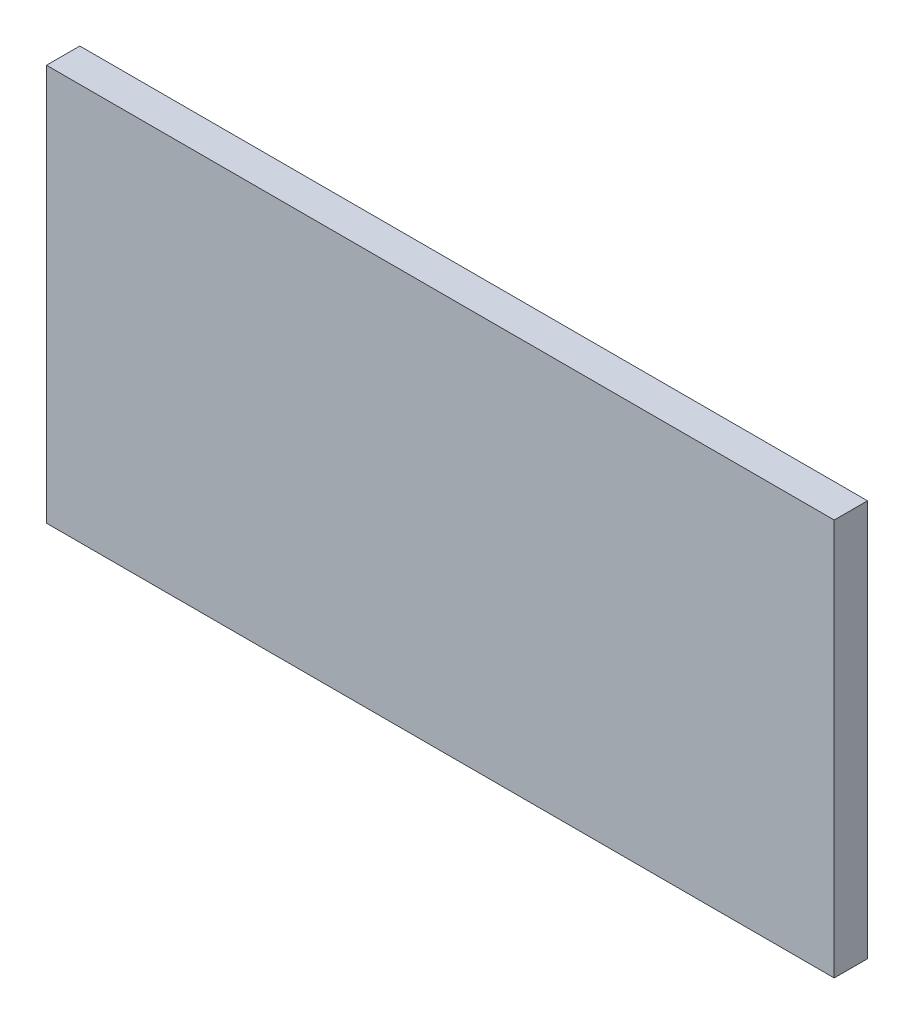
ISO-10303-21;
HEADER;
FILE_DESCRIPTION(('STEP AP214'),'2;1');
FILE_NAME('part.step','',(''),(''),'','','');
FILE_SCHEMA(('AUTOMOTIVE_DESIGN { 1 0 10303 214 1 1 1 1 }'));
ENDSEC;
DATA;
#1=APPLICATION_CONTEXT('core data for automotive mechanical design processes');
#2=APPLICATION_PROTOCOL_DEFINITION('international standard','automotive_design',2000,#1);
#3=PRODUCT_CONTEXT('',#1,'mechanical');
#4=PRODUCT('Part','Part','',(#3));
#5=PRODUCT_RELATED_PRODUCT_CATEGORY('part','',(#4));
#6=PRODUCT_DEFINITION_FORMATION('','',#4);
#7=PRODUCT_DEFINITION_CONTEXT('part definition',#1,'design');
#8=PRODUCT_DEFINITION('design','',#6,#7);
#9=PRODUCT_DEFINITION_SHAPE('','',#8);
#10=(LENGTH_UNIT() NAMED_UNIT(*) SI_UNIT(.MILLI.,.METRE.));
#11=(NAMED_UNIT(*) PLANE_ANGLE_UNIT() SI_UNIT($,.RADIAN.));
#12=(NAMED_UNIT(*) SI_UNIT($,.STERADIAN.) SOLID_ANGLE_UNIT());
#13=UNCERTAINTY_MEASURE_WITH_UNIT(LENGTH_MEASURE(1.E-05),#10,'distance_accuracy_value','');
#14=(GEOMETRIC_REPRESENTATION_CONTEXT(3) GLOBAL_UNCERTAINTY_ASSIGNED_CONTEXT((#13)) GLOBAL_UNIT_ASSIGNED_CONTEXT((#10,
#11,#12)) REPRESENTATION_CONTEXT('',''));
#15=CARTESIAN_POINT('',(0.,0.,0.));
#16=DIRECTION('',(0.,0.,1.));
#17=DIRECTION('',(1.,0.,0.));
#18=AXIS2_PLACEMENT_3D('',#15,#16,#17);
#19=CARTESIAN_POINT('',(0.,0.,6.));
#20=DIRECTION('',(-1.,0.,0.));
#21=DIRECTION('',(0.,0.,1.));
#22=AXIS2_PLACEMENT_3D('',#19,#20,#21);
#23=PLANE('',#22);
#24=DIRECTION('',(0.,1.,0.));
#25=VECTOR('',#24,1.);
#26=CARTESIAN_POINT('',(0.,0.,0.));
#27=LINE('',#26,#25);
#28=CARTESIAN_POINT('',(0.,0.,0.));
#29=VERTEX_POINT('',#28);
#30=CARTESIAN_POINT('',(0.,71.5,0.));
#31=VERTEX_POINT('',#30);
#32=EDGE_CURVE('E96',#29,#31,#27,.T.);
#33=ORIENTED_EDGE('',*,*,#32,.T.);
#34=DIRECTION('',(0.,0.,-1.));
#35=VECTOR('',#34,1.);
#36=CARTESIAN_POINT('',(0.,71.5,6.));
#37=LINE('',#36,#35);
#38=CARTESIAN_POINT('',(0.,71.5,6.));
#39=VERTEX_POINT('',#38);
#40=EDGE_CURVE('E11',#39,#31,#37,.T.);
#41=ORIENTED_EDGE('',*,*,#40,.F.);
#42=DIRECTION('',(0.,1.,0.));
#43=VECTOR('',#42,1.);
#44=CARTESIAN_POINT('',(0.,0.,6.));
#45=LINE('',#44,#43);
#46=CARTESIAN_POINT('',(0.,0.,6.));
#47=VERTEX_POINT('',#46);
#48=EDGE_CURVE('E84',#47,#39,#45,.T.);
#49=ORIENTED_EDGE('',*,*,#48,.F.);
#50=DIRECTION('',(0.,0.,-1.));
#51=VECTOR('',#50,1.);
#52=CARTESIAN_POINT('',(0.,0.,6.));
#53=LINE('',#52,#51);
#54=EDGE_CURVE('E92',#47,#29,#53,.T.);
#55=ORIENTED_EDGE('',*,*,#54,.T.);
#56=EDGE_LOOP('',(#33,#41,#49,#55));
#57=FACE_BOUND('',#56,.T.);
#58=ADVANCED_FACE('F33',(#57),#23,.F.);
#59=CARTESIAN_POINT('',(0.,71.5,6.));
#60=DIRECTION('',(0.,-1.,0.));
#61=DIRECTION('',(0.,0.,-1.));
#62=AXIS2_PLACEMENT_3D('',#59,#60,#61);
#63=PLANE('',#62);
#64=DIRECTION('',(-1.,0.,0.));
#65=VECTOR('',#64,1.);
#66=CARTESIAN_POINT('',(0.,71.5,0.));
#67=LINE('',#66,#65);
#68=CARTESIAN_POINT('',(-142.,71.5,0.));
#69=VERTEX_POINT('',#68);
#70=EDGE_CURVE('E88',#31,#69,#67,.T.);
#71=ORIENTED_EDGE('',*,*,#70,.T.);
#72=DIRECTION('',(0.,0.,-1.));
#73=VECTOR('',#72,1.);
#74=CARTESIAN_POINT('',(-142.,71.5,6.));
#75=LINE('',#74,#73);
#76=CARTESIAN_POINT('',(-142.,71.5,6.));
#77=VERTEX_POINT('',#76);
#78=EDGE_CURVE('E41',#77,#69,#75,.T.);
#79=ORIENTED_EDGE('',*,*,#78,.F.);
#80=DIRECTION('',(-1.,0.,0.));
#81=VECTOR('',#80,1.);
#82=CARTESIAN_POINT('',(0.,71.5,6.));
#83=LINE('',#82,#81);
#84=EDGE_CURVE('E79',#39,#77,#83,.T.);
#85=ORIENTED_EDGE('',*,*,#84,.F.);
#86=ORIENTED_EDGE('',*,*,#40,.T.);
#87=EDGE_LOOP('',(#71,#79,#85,#86));
#88=FACE_BOUND('',#87,.T.);
#89=ADVANCED_FACE('F87',(#88),#63,.F.);
#90=CARTESIAN_POINT('',(-142.,0.,6.));
#91=DIRECTION('',(1.,0.,0.));
#92=DIRECTION('',(0.,0.,-1.));
#93=AXIS2_PLACEMENT_3D('',#90,#91,#92);
#94=PLANE('',#93);
#95=DIRECTION('',(0.,-1.,0.));
#96=VECTOR('',#95,1.);
#97=CARTESIAN_POINT('',(-142.,0.,0.));
#98=LINE('',#97,#96);
#99=CARTESIAN_POINT('',(-142.,0.,0.));
#100=VERTEX_POINT('',#99);
#101=EDGE_CURVE('E66',#69,#100,#98,.T.);
#102=ORIENTED_EDGE('',*,*,#101,.T.);
#103=DIRECTION('',(0.,0.,-1.));
#104=VECTOR('',#103,1.);
#105=CARTESIAN_POINT('',(-142.,0.,6.));
#106=LINE('',#105,#104);
#107=CARTESIAN_POINT('',(-142.,0.,6.));
#108=VERTEX_POINT('',#107);
#109=EDGE_CURVE('E89',#108,#100,#106,.T.);
#110=ORIENTED_EDGE('',*,*,#109,.F.);
#111=DIRECTION('',(0.,-1.,0.));
#112=VECTOR('',#111,1.);
#113=CARTESIAN_POINT('',(-142.,0.,6.));
#114=LINE('',#113,#112);
#115=EDGE_CURVE('E82',#77,#108,#114,.T.);
#116=ORIENTED_EDGE('',*,*,#115,.F.);
#117=ORIENTED_EDGE('',*,*,#78,.T.);
#118=EDGE_LOOP('',(#102,#110,#116,#117));
#119=FACE_BOUND('',#118,.T.);
#120=ADVANCED_FACE('F90',(#119),#94,.F.);
#121=CARTESIAN_POINT('',(0.,0.,6.));
#122=DIRECTION('',(0.,1.,0.));
#123=DIRECTION('',(-1.,0.,0.));
#124=AXIS2_PLACEMENT_3D('',#121,#122,#123);
#125=PLANE('',#124);
#126=DIRECTION('',(1.,0.,0.));
#127=VECTOR('',#126,1.);
#128=CARTESIAN_POINT('',(0.,0.,0.));
#129=LINE('',#128,#127);
#130=EDGE_CURVE('E72',#100,#29,#129,.T.);
#131=ORIENTED_EDGE('',*,*,#130,.T.);
#132=ORIENTED_EDGE('',*,*,#54,.F.);
#133=DIRECTION('',(1.,0.,0.));
#134=VECTOR('',#133,1.);
#135=CARTESIAN_POINT('',(0.,0.,6.));
#136=LINE('',#135,#134);
#137=EDGE_CURVE('E49',#108,#47,#136,.T.);
#138=ORIENTED_EDGE('',*,*,#137,.F.);
#139=ORIENTED_EDGE('',*,*,#109,.T.);
#140=EDGE_LOOP('',(#131,#132,#138,#139));
#141=FACE_BOUND('',#140,.T.);
#142=ADVANCED_FACE('F103',(#141),#125,.F.);
#143=CARTESIAN_POINT('',(0.,0.,6.));
#144=DIRECTION('',(0.,0.,1.));
#145=DIRECTION('',(1.,0.,0.));
#146=AXIS2_PLACEMENT_3D('',#143,#144,#145);
#147=PLANE('',#146);
#148=ORIENTED_EDGE('',*,*,#48,.T.);
#149=ORIENTED_EDGE('',*,*,#84,.T.);
#150=ORIENTED_EDGE('',*,*,#115,.T.);
#151=ORIENTED_EDGE('',*,*,#137,.T.);
#152=EDGE_LOOP('',(#148,#149,#150,#151));
#153=FACE_BOUND('',#152,.T.);
#154=ADVANCED_FACE('F80',(#153),#147,.T.);
#155=CARTESIAN_POINT('',(0.,0.,0.));
#156=DIRECTION('',(0.,0.,1.));
#157=DIRECTION('',(1.,0.,0.));
#158=AXIS2_PLACEMENT_3D('',#155,#156,#157);
#159=PLANE('',#158);
#160=ORIENTED_EDGE('',*,*,#32,.F.);
#161=ORIENTED_EDGE('',*,*,#130,.F.);
#162=ORIENTED_EDGE('',*,*,#101,.F.);
#163=ORIENTED_EDGE('',*,*,#70,.F.);
#164=EDGE_LOOP('',(#160,#161,#162,#163));
#165=FACE_BOUND('',#164,.T.);
#166=ADVANCED_FACE('F106',(#165),#159,.F.);
#167=CLOSED_SHELL('',(#58,#89,#120,#142,#154,#166));
#168=MANIFOLD_SOLID_BREP('B2',#167);
#169=ADVANCED_BREP_SHAPE_REPRESENTATION('',(#18,#168),#14);
#170=SHAPE_DEFINITION_REPRESENTATION(#9,#169);
ENDSEC;
END-ISO-10303-21;
